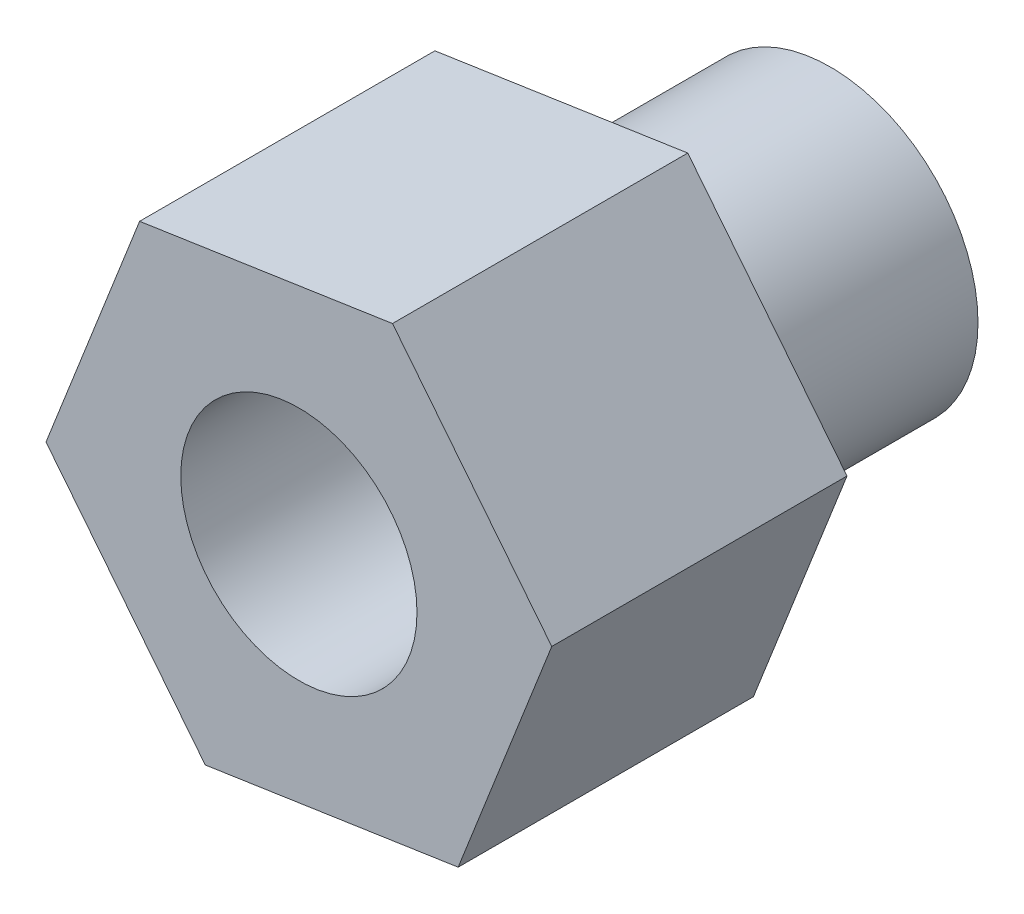
ISO-10303-21;
HEADER;
FILE_DESCRIPTION(('STEP AP214'),'2;1');
FILE_NAME('part.step','',(''),(''),'','','');
FILE_SCHEMA(('AUTOMOTIVE_DESIGN { 1 0 10303 214 1 1 1 1 }'));
ENDSEC;
DATA;
#1=APPLICATION_CONTEXT('core data for automotive mechanical design processes');
#2=APPLICATION_PROTOCOL_DEFINITION('international standard','automotive_design',2000,#1);
#3=PRODUCT_CONTEXT('',#1,'mechanical');
#4=PRODUCT('Part','Part','',(#3));
#5=PRODUCT_RELATED_PRODUCT_CATEGORY('part','',(#4));
#6=PRODUCT_DEFINITION_FORMATION('','',#4);
#7=PRODUCT_DEFINITION_CONTEXT('part definition',#1,'design');
#8=PRODUCT_DEFINITION('design','',#6,#7);
#9=PRODUCT_DEFINITION_SHAPE('','',#8);
#10=(LENGTH_UNIT() NAMED_UNIT(*) SI_UNIT(.MILLI.,.METRE.));
#11=(NAMED_UNIT(*) PLANE_ANGLE_UNIT() SI_UNIT($,.RADIAN.));
#12=(NAMED_UNIT(*) SI_UNIT($,.STERADIAN.) SOLID_ANGLE_UNIT());
#13=UNCERTAINTY_MEASURE_WITH_UNIT(LENGTH_MEASURE(1.E-05),#10,'distance_accuracy_value','');
#14=(GEOMETRIC_REPRESENTATION_CONTEXT(3) GLOBAL_UNCERTAINTY_ASSIGNED_CONTEXT((#13)) GLOBAL_UNIT_ASSIGNED_CONTEXT((#10,
#11,#12)) REPRESENTATION_CONTEXT('',''));
#15=CARTESIAN_POINT('',(0.,0.,0.));
#16=DIRECTION('',(0.,0.,1.));
#17=DIRECTION('',(1.,0.,0.));
#18=AXIS2_PLACEMENT_3D('',#15,#16,#17);
#19=CARTESIAN_POINT('',(0.,0.,8.));
#20=DIRECTION('',(0.,0.,-1.));
#21=DIRECTION('',(-1.,0.,0.));
#22=AXIS2_PLACEMENT_3D('',#19,#20,#21);
#23=CYLINDRICAL_SURFACE('',#22,5.);
#24=CARTESIAN_POINT('',(0.,0.,8.));
#25=DIRECTION('',(0.,0.,1.));
#26=DIRECTION('',(1.,0.,0.));
#27=AXIS2_PLACEMENT_3D('',#24,#25,#26);
#28=CIRCLE('',#27,5.);
#29=CARTESIAN_POINT('',(5.,0.,8.));
#30=VERTEX_POINT('',#29);
#31=EDGE_CURVE('E11',#30,#30,#28,.T.);
#32=ORIENTED_EDGE('',*,*,#31,.F.);
#33=EDGE_LOOP('',(#32));
#34=FACE_BOUND('',#33,.T.);
#35=CARTESIAN_POINT('',(0.,0.,0.));
#36=DIRECTION('',(0.,0.,1.));
#37=DIRECTION('',(1.,0.,0.));
#38=AXIS2_PLACEMENT_3D('',#35,#36,#37);
#39=CIRCLE('',#38,5.);
#40=CARTESIAN_POINT('',(5.,0.,0.));
#41=VERTEX_POINT('',#40);
#42=EDGE_CURVE('E35',#41,#41,#39,.T.);
#43=ORIENTED_EDGE('',*,*,#42,.T.);
#44=EDGE_LOOP('',(#43));
#45=FACE_BOUND('',#44,.T.);
#46=ADVANCED_FACE('F32',(#34,#45),#23,.T.);
#47=CARTESIAN_POINT('',(0.,0.,0.));
#48=DIRECTION('',(0.,0.,1.));
#49=DIRECTION('',(1.,0.,0.));
#50=AXIS2_PLACEMENT_3D('',#47,#48,#49);
#51=PLANE('',#50);
#52=CARTESIAN_POINT('',(0.,0.,0.));
#53=DIRECTION('',(0.,0.,1.));
#54=DIRECTION('',(1.,0.,0.));
#55=AXIS2_PLACEMENT_3D('',#52,#53,#54);
#56=CIRCLE('',#55,4.);
#57=CARTESIAN_POINT('',(4.,0.,0.));
#58=VERTEX_POINT('',#57);
#59=EDGE_CURVE('E121',#58,#58,#56,.T.);
#60=ORIENTED_EDGE('',*,*,#59,.T.);
#61=EDGE_LOOP('',(#60));
#62=FACE_BOUND('',#61,.T.);
#63=ORIENTED_EDGE('',*,*,#42,.F.);
#64=EDGE_LOOP('',(#63));
#65=FACE_BOUND('',#64,.T.);
#66=ADVANCED_FACE('F141',(#62,#65),#51,.F.);
#67=CARTESIAN_POINT('',(8.56453146321387,1.28405639113696,8.));
#68=DIRECTION('',(0.,0.,1.));
#69=DIRECTION('',(1.,0.,0.));
#70=AXIS2_PLACEMENT_3D('',#67,#68,#69);
#71=PLANE('',#70);
#72=DIRECTION('',(0.366067815463259,0.930588176629145,0.));
#73=VECTOR('',#72,1.);
#74=CARTESIAN_POINT('',(5.39429118622331,-6.77507362308585,8.));
#75=LINE('',#74,#73);
#76=CARTESIAN_POINT('',(5.39429118622331,-6.77507362308585,8.));
#77=VERTEX_POINT('',#76);
#78=CARTESIAN_POINT('',(8.56453146321387,1.28405639113696,8.));
#79=VERTEX_POINT('',#78);
#80=EDGE_CURVE('E117',#77,#79,#75,.T.);
#81=ORIENTED_EDGE('',*,*,#80,.F.);
#82=DIRECTION('',(0.98894690915391,0.148270060615516,0.));
#83=VECTOR('',#82,1.);
#84=CARTESIAN_POINT('',(-3.17024027699056,-8.0591300142228,8.));
#85=LINE('',#84,#83);
#86=CARTESIAN_POINT('',(-3.17024027699056,-8.0591300142228,8.));
#87=VERTEX_POINT('',#86);
#88=EDGE_CURVE('E77',#87,#77,#85,.T.);
#89=ORIENTED_EDGE('',*,*,#88,.F.);
#90=DIRECTION('',(0.622879093690651,-0.782318116013629,0.));
#91=VECTOR('',#90,1.);
#92=CARTESIAN_POINT('',(-8.56453146321387,-1.28405639113696,8.));
#93=LINE('',#92,#91);
#94=CARTESIAN_POINT('',(-8.56453146321387,-1.28405639113696,8.));
#95=VERTEX_POINT('',#94);
#96=EDGE_CURVE('E71',#95,#87,#93,.T.);
#97=ORIENTED_EDGE('',*,*,#96,.F.);
#98=DIRECTION('',(-0.366067815463259,-0.930588176629145,0.));
#99=VECTOR('',#98,1.);
#100=CARTESIAN_POINT('',(-5.39429118622331,6.77507362308584,8.));
#101=LINE('',#100,#99);
#102=CARTESIAN_POINT('',(-5.39429118622331,6.77507362308584,8.));
#103=VERTEX_POINT('',#102);
#104=EDGE_CURVE('E107',#103,#95,#101,.T.);
#105=ORIENTED_EDGE('',*,*,#104,.F.);
#106=DIRECTION('',(-0.98894690915391,-0.148270060615516,0.));
#107=VECTOR('',#106,1.);
#108=CARTESIAN_POINT('',(3.17024027699057,8.0591300142228,8.));
#109=LINE('',#108,#107);
#110=CARTESIAN_POINT('',(3.17024027699057,8.0591300142228,8.));
#111=VERTEX_POINT('',#110);
#112=EDGE_CURVE('E123',#111,#103,#109,.T.);
#113=ORIENTED_EDGE('',*,*,#112,.F.);
#114=DIRECTION('',(-0.62287909369065,0.782318116013629,0.));
#115=VECTOR('',#114,1.);
#116=CARTESIAN_POINT('',(8.56453146321387,1.28405639113696,8.));
#117=LINE('',#116,#115);
#118=EDGE_CURVE('E120',#79,#111,#117,.T.);
#119=ORIENTED_EDGE('',*,*,#118,.F.);
#120=EDGE_LOOP('',(#81,#89,#97,#105,#113,#119));
#121=FACE_BOUND('',#120,.T.);
#122=ORIENTED_EDGE('',*,*,#31,.T.);
#123=EDGE_LOOP('',(#122));
#124=FACE_BOUND('',#123,.T.);
#125=ADVANCED_FACE('F143',(#121,#124),#71,.F.);
#126=CARTESIAN_POINT('',(5.39429118622331,-6.77507362308585,18.));
#127=DIRECTION('',(-0.930588176629145,0.366067815463259,0.));
#128=DIRECTION('',(-0.366067815463259,-0.930588176629146,0.));
#129=AXIS2_PLACEMENT_3D('',#126,#127,#128);
#130=PLANE('',#129);
#131=ORIENTED_EDGE('',*,*,#80,.T.);
#132=DIRECTION('',(0.,0.,-1.));
#133=VECTOR('',#132,1.);
#134=CARTESIAN_POINT('',(8.56453146321387,1.28405639113696,18.));
#135=LINE('',#134,#133);
#136=CARTESIAN_POINT('',(8.56453146321387,1.28405639113696,18.));
#137=VERTEX_POINT('',#136);
#138=EDGE_CURVE('E135',#137,#79,#135,.T.);
#139=ORIENTED_EDGE('',*,*,#138,.F.);
#140=DIRECTION('',(0.366067815463259,0.930588176629145,0.));
#141=VECTOR('',#140,1.);
#142=CARTESIAN_POINT('',(5.39429118622331,-6.77507362308585,18.));
#143=LINE('',#142,#141);
#144=CARTESIAN_POINT('',(5.39429118622331,-6.77507362308585,18.));
#145=VERTEX_POINT('',#144);
#146=EDGE_CURVE('E128',#145,#137,#143,.T.);
#147=ORIENTED_EDGE('',*,*,#146,.F.);
#148=DIRECTION('',(0.,0.,-1.));
#149=VECTOR('',#148,1.);
#150=CARTESIAN_POINT('',(5.39429118622331,-6.77507362308585,18.));
#151=LINE('',#150,#149);
#152=EDGE_CURVE('E113',#145,#77,#151,.T.);
#153=ORIENTED_EDGE('',*,*,#152,.T.);
#154=EDGE_LOOP('',(#131,#139,#147,#153));
#155=FACE_BOUND('',#154,.T.);
#156=ADVANCED_FACE('F149',(#155),#130,.F.);
#157=CARTESIAN_POINT('',(8.56453146321387,1.28405639113696,18.));
#158=DIRECTION('',(-0.782318116013629,-0.62287909369065,0.));
#159=DIRECTION('',(0.62287909369065,-0.782318116013629,0.));
#160=AXIS2_PLACEMENT_3D('',#157,#158,#159);
#161=PLANE('',#160);
#162=ORIENTED_EDGE('',*,*,#118,.T.);
#163=DIRECTION('',(0.,0.,-1.));
#164=VECTOR('',#163,1.);
#165=CARTESIAN_POINT('',(3.17024027699057,8.0591300142228,18.));
#166=LINE('',#165,#164);
#167=CARTESIAN_POINT('',(3.17024027699057,8.0591300142228,18.));
#168=VERTEX_POINT('',#167);
#169=EDGE_CURVE('E132',#168,#111,#166,.T.);
#170=ORIENTED_EDGE('',*,*,#169,.F.);
#171=DIRECTION('',(-0.62287909369065,0.782318116013629,0.));
#172=VECTOR('',#171,1.);
#173=CARTESIAN_POINT('',(8.56453146321387,1.28405639113696,18.));
#174=LINE('',#173,#172);
#175=EDGE_CURVE('E86',#137,#168,#174,.T.);
#176=ORIENTED_EDGE('',*,*,#175,.F.);
#177=ORIENTED_EDGE('',*,*,#138,.T.);
#178=EDGE_LOOP('',(#162,#170,#176,#177));
#179=FACE_BOUND('',#178,.T.);
#180=ADVANCED_FACE('F157',(#179),#161,.F.);
#181=CARTESIAN_POINT('',(3.17024027699057,8.0591300142228,18.));
#182=DIRECTION('',(0.148270060615516,-0.98894690915391,0.));
#183=DIRECTION('',(0.98894690915391,0.148270060615516,0.));
#184=AXIS2_PLACEMENT_3D('',#181,#182,#183);
#185=PLANE('',#184);
#186=ORIENTED_EDGE('',*,*,#112,.T.);
#187=DIRECTION('',(0.,0.,-1.));
#188=VECTOR('',#187,1.);
#189=CARTESIAN_POINT('',(-5.39429118622331,6.77507362308584,18.));
#190=LINE('',#189,#188);
#191=CARTESIAN_POINT('',(-5.39429118622331,6.77507362308584,18.));
#192=VERTEX_POINT('',#191);
#193=EDGE_CURVE('E108',#192,#103,#190,.T.);
#194=ORIENTED_EDGE('',*,*,#193,.F.);
#195=DIRECTION('',(-0.98894690915391,-0.148270060615516,0.));
#196=VECTOR('',#195,1.);
#197=CARTESIAN_POINT('',(3.17024027699057,8.0591300142228,18.));
#198=LINE('',#197,#196);
#199=EDGE_CURVE('E99',#168,#192,#198,.T.);
#200=ORIENTED_EDGE('',*,*,#199,.F.);
#201=ORIENTED_EDGE('',*,*,#169,.T.);
#202=EDGE_LOOP('',(#186,#194,#200,#201));
#203=FACE_BOUND('',#202,.T.);
#204=ADVANCED_FACE('F161',(#203),#185,.F.);
#205=CARTESIAN_POINT('',(-5.39429118622331,6.77507362308584,18.));
#206=DIRECTION('',(0.930588176629145,-0.366067815463259,0.));
#207=DIRECTION('',(0.366067815463259,0.930588176629145,0.));
#208=AXIS2_PLACEMENT_3D('',#205,#206,#207);
#209=PLANE('',#208);
#210=ORIENTED_EDGE('',*,*,#104,.T.);
#211=DIRECTION('',(0.,0.,-1.));
#212=VECTOR('',#211,1.);
#213=CARTESIAN_POINT('',(-8.56453146321387,-1.28405639113696,18.));
#214=LINE('',#213,#212);
#215=CARTESIAN_POINT('',(-8.56453146321387,-1.28405639113696,18.));
#216=VERTEX_POINT('',#215);
#217=EDGE_CURVE('E104',#216,#95,#214,.T.);
#218=ORIENTED_EDGE('',*,*,#217,.F.);
#219=DIRECTION('',(-0.366067815463259,-0.930588176629145,0.));
#220=VECTOR('',#219,1.);
#221=CARTESIAN_POINT('',(-5.39429118622331,6.77507362308584,18.));
#222=LINE('',#221,#220);
#223=EDGE_CURVE('E93',#192,#216,#222,.T.);
#224=ORIENTED_EDGE('',*,*,#223,.F.);
#225=ORIENTED_EDGE('',*,*,#193,.T.);
#226=EDGE_LOOP('',(#210,#218,#224,#225));
#227=FACE_BOUND('',#226,.T.);
#228=ADVANCED_FACE('F105',(#227),#209,.F.);
#229=CARTESIAN_POINT('',(-8.56453146321387,-1.28405639113696,18.));
#230=DIRECTION('',(0.782318116013629,0.622879093690651,0.));
#231=DIRECTION('',(-0.622879093690651,0.782318116013629,0.));
#232=AXIS2_PLACEMENT_3D('',#229,#230,#231);
#233=PLANE('',#232);
#234=ORIENTED_EDGE('',*,*,#96,.T.);
#235=DIRECTION('',(0.,0.,-1.));
#236=VECTOR('',#235,1.);
#237=CARTESIAN_POINT('',(-3.17024027699056,-8.0591300142228,18.));
#238=LINE('',#237,#236);
#239=CARTESIAN_POINT('',(-3.17024027699056,-8.0591300142228,18.));
#240=VERTEX_POINT('',#239);
#241=EDGE_CURVE('E109',#240,#87,#238,.T.);
#242=ORIENTED_EDGE('',*,*,#241,.F.);
#243=DIRECTION('',(0.622879093690651,-0.782318116013629,0.));
#244=VECTOR('',#243,1.);
#245=CARTESIAN_POINT('',(-8.56453146321387,-1.28405639113696,18.));
#246=LINE('',#245,#244);
#247=EDGE_CURVE('E97',#216,#240,#246,.T.);
#248=ORIENTED_EDGE('',*,*,#247,.F.);
#249=ORIENTED_EDGE('',*,*,#217,.T.);
#250=EDGE_LOOP('',(#234,#242,#248,#249));
#251=FACE_BOUND('',#250,.T.);
#252=ADVANCED_FACE('F111',(#251),#233,.F.);
#253=CARTESIAN_POINT('',(-3.17024027699056,-8.0591300142228,18.));
#254=DIRECTION('',(-0.148270060615516,0.98894690915391,0.));
#255=DIRECTION('',(-0.98894690915391,-0.148270060615516,0.));
#256=AXIS2_PLACEMENT_3D('',#253,#254,#255);
#257=PLANE('',#256);
#258=ORIENTED_EDGE('',*,*,#88,.T.);
#259=ORIENTED_EDGE('',*,*,#152,.F.);
#260=DIRECTION('',(0.98894690915391,0.148270060615516,0.));
#261=VECTOR('',#260,1.);
#262=CARTESIAN_POINT('',(-3.17024027699056,-8.0591300142228,18.));
#263=LINE('',#262,#261);
#264=EDGE_CURVE('E48',#240,#145,#263,.T.);
#265=ORIENTED_EDGE('',*,*,#264,.F.);
#266=ORIENTED_EDGE('',*,*,#241,.T.);
#267=EDGE_LOOP('',(#258,#259,#265,#266));
#268=FACE_BOUND('',#267,.T.);
#269=ADVANCED_FACE('F169',(#268),#257,.F.);
#270=CARTESIAN_POINT('',(8.56453146321387,1.28405639113696,18.));
#271=DIRECTION('',(0.,0.,1.));
#272=DIRECTION('',(1.,0.,0.));
#273=AXIS2_PLACEMENT_3D('',#270,#271,#272);
#274=PLANE('',#273);
#275=CARTESIAN_POINT('',(0.,0.,18.));
#276=DIRECTION('',(0.,0.,1.));
#277=DIRECTION('',(1.,0.,0.));
#278=AXIS2_PLACEMENT_3D('',#275,#276,#277);
#279=CIRCLE('',#278,4.);
#280=CARTESIAN_POINT('',(4.,0.,18.));
#281=VERTEX_POINT('',#280);
#282=EDGE_CURVE('E184',#281,#281,#279,.T.);
#283=ORIENTED_EDGE('',*,*,#282,.F.);
#284=EDGE_LOOP('',(#283));
#285=FACE_BOUND('',#284,.T.);
#286=ORIENTED_EDGE('',*,*,#146,.T.);
#287=ORIENTED_EDGE('',*,*,#175,.T.);
#288=ORIENTED_EDGE('',*,*,#199,.T.);
#289=ORIENTED_EDGE('',*,*,#223,.T.);
#290=ORIENTED_EDGE('',*,*,#247,.T.);
#291=ORIENTED_EDGE('',*,*,#264,.T.);
#292=EDGE_LOOP('',(#286,#287,#288,#289,#290,#291));
#293=FACE_BOUND('',#292,.T.);
#294=ADVANCED_FACE('F95',(#285,#293),#274,.T.);
#295=CARTESIAN_POINT('',(0.,0.,0.));
#296=DIRECTION('',(0.,0.,1.));
#297=DIRECTION('',(1.,0.,0.));
#298=AXIS2_PLACEMENT_3D('',#295,#296,#297);
#299=CYLINDRICAL_SURFACE('',#298,4.);
#300=ORIENTED_EDGE('',*,*,#59,.F.);
#301=EDGE_LOOP('',(#300));
#302=FACE_BOUND('',#301,.T.);
#303=ORIENTED_EDGE('',*,*,#282,.T.);
#304=EDGE_LOOP('',(#303));
#305=FACE_BOUND('',#304,.T.);
#306=ADVANCED_FACE('F174',(#302,#305),#299,.F.);
#307=CLOSED_SHELL('',(#46,#66,#125,#156,#180,#204,#228,#252,#269,#294,#306));
#308=MANIFOLD_SOLID_BREP('B2',#307);
#309=ADVANCED_BREP_SHAPE_REPRESENTATION('',(#18,#308),#14);
#310=SHAPE_DEFINITION_REPRESENTATION(#9,#309);
ENDSEC;
END-ISO-10303-21;
